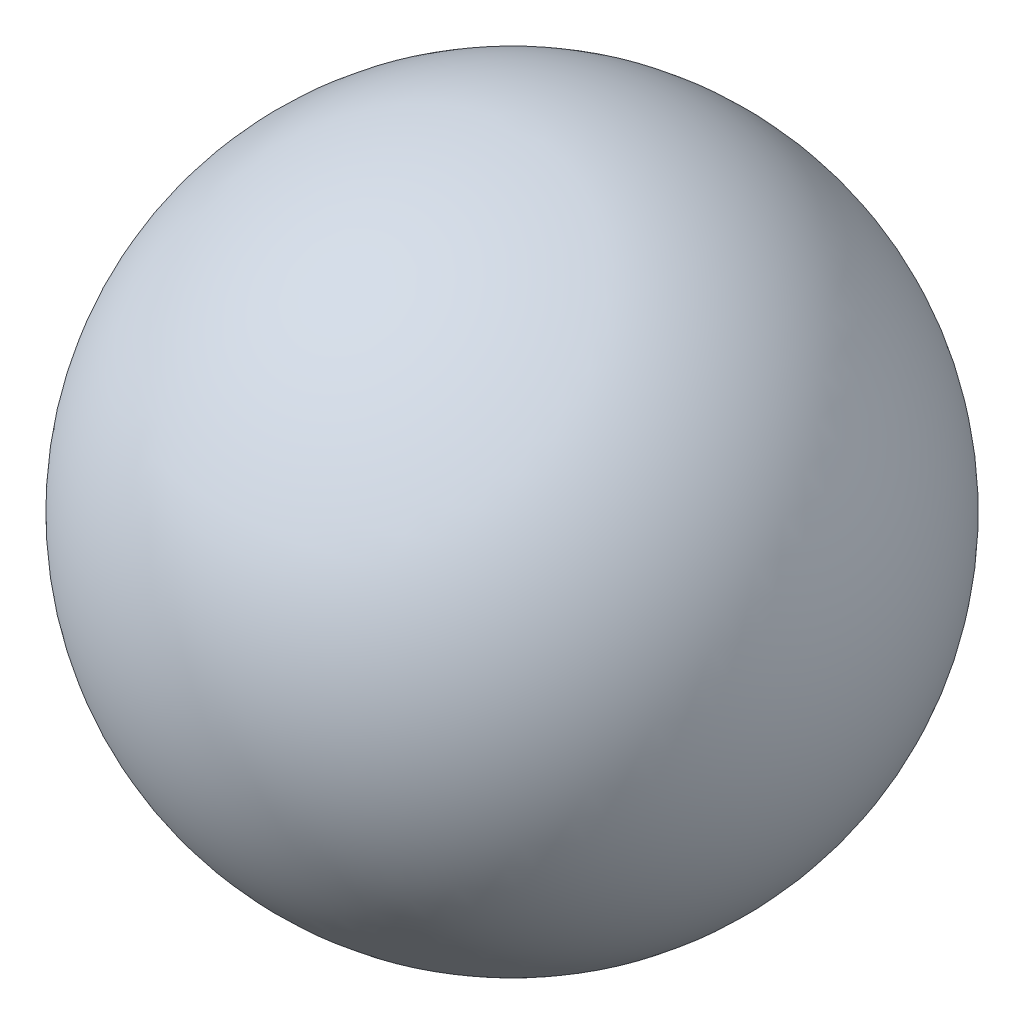
ISO-10303-21;
HEADER;
FILE_DESCRIPTION(('STEP AP214'),'2;1');
FILE_NAME('part.step','',(''),(''),'','','');
FILE_SCHEMA(('AUTOMOTIVE_DESIGN { 1 0 10303 214 1 1 1 1 }'));
ENDSEC;
DATA;
#1=APPLICATION_CONTEXT('core data for automotive mechanical design processes');
#2=APPLICATION_PROTOCOL_DEFINITION('international standard','automotive_design',2000,#1);
#3=PRODUCT_CONTEXT('',#1,'mechanical');
#4=PRODUCT('Part','Part','',(#3));
#5=PRODUCT_RELATED_PRODUCT_CATEGORY('part','',(#4));
#6=PRODUCT_DEFINITION_FORMATION('','',#4);
#7=PRODUCT_DEFINITION_CONTEXT('part definition',#1,'design');
#8=PRODUCT_DEFINITION('design','',#6,#7);
#9=PRODUCT_DEFINITION_SHAPE('','',#8);
#10=(LENGTH_UNIT() NAMED_UNIT(*) SI_UNIT(.MILLI.,.METRE.));
#11=(NAMED_UNIT(*) PLANE_ANGLE_UNIT() SI_UNIT($,.RADIAN.));
#12=(NAMED_UNIT(*) SI_UNIT($,.STERADIAN.) SOLID_ANGLE_UNIT());
#13=UNCERTAINTY_MEASURE_WITH_UNIT(LENGTH_MEASURE(1.E-05),#10,'distance_accuracy_value','');
#14=(GEOMETRIC_REPRESENTATION_CONTEXT(3) GLOBAL_UNCERTAINTY_ASSIGNED_CONTEXT((#13)) GLOBAL_UNIT_ASSIGNED_CONTEXT((#10,
#11,#12)) REPRESENTATION_CONTEXT('',''));
#15=CARTESIAN_POINT('',(0.,0.,0.));
#16=DIRECTION('',(0.,0.,1.));
#17=DIRECTION('',(1.,0.,0.));
#18=AXIS2_PLACEMENT_3D('',#15,#16,#17);
#19=CARTESIAN_POINT('',(0.,0.,0.));
#20=DIRECTION('',(0.,1.,0.));
#21=DIRECTION('',(-1.,0.,0.));
#22=AXIS2_PLACEMENT_3D('',#19,#20,#21);
#23=SPHERICAL_SURFACE('',#22,1.389);
#24=CARTESIAN_POINT('',(0.,1.389,0.));
#25=VERTEX_POINT('',#24);
#26=VERTEX_LOOP('',#25);
#27=FACE_BOUND('',#26,.T.);
#28=ADVANCED_FACE('F39',(#27),#23,.T.);
#29=CLOSED_SHELL('',(#28));
#30=MANIFOLD_SOLID_BREP('B2',#29);
#31=ADVANCED_BREP_SHAPE_REPRESENTATION('',(#18,#30),#14);
#32=SHAPE_DEFINITION_REPRESENTATION(#9,#31);
ENDSEC;
END-ISO-10303-21;
